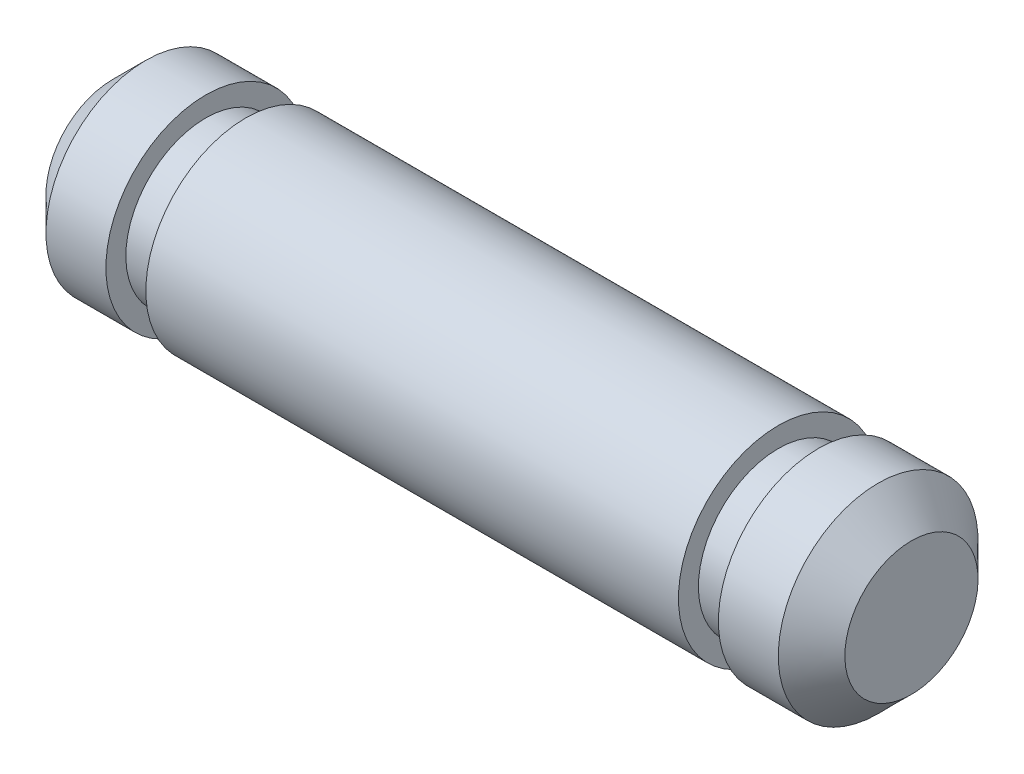
ISO-10303-21;
HEADER;
FILE_DESCRIPTION(('STEP AP214'),'2;1');
FILE_NAME('part.step','',(''),(''),'','','');
FILE_SCHEMA(('AUTOMOTIVE_DESIGN { 1 0 10303 214 1 1 1 1 }'));
ENDSEC;
DATA;
#1=APPLICATION_CONTEXT('core data for automotive mechanical design processes');
#2=APPLICATION_PROTOCOL_DEFINITION('international standard','automotive_design',2000,#1);
#3=PRODUCT_CONTEXT('',#1,'mechanical');
#4=PRODUCT('Part','Part','',(#3));
#5=PRODUCT_RELATED_PRODUCT_CATEGORY('part','',(#4));
#6=PRODUCT_DEFINITION_FORMATION('','',#4);
#7=PRODUCT_DEFINITION_CONTEXT('part definition',#1,'design');
#8=PRODUCT_DEFINITION('design','',#6,#7);
#9=PRODUCT_DEFINITION_SHAPE('','',#8);
#10=(LENGTH_UNIT() NAMED_UNIT(*) SI_UNIT(.MILLI.,.METRE.));
#11=(NAMED_UNIT(*) PLANE_ANGLE_UNIT() SI_UNIT($,.RADIAN.));
#12=(NAMED_UNIT(*) SI_UNIT($,.STERADIAN.) SOLID_ANGLE_UNIT());
#13=UNCERTAINTY_MEASURE_WITH_UNIT(LENGTH_MEASURE(1.E-05),#10,'distance_accuracy_value','');
#14=(GEOMETRIC_REPRESENTATION_CONTEXT(3) GLOBAL_UNCERTAINTY_ASSIGNED_CONTEXT((#13)) GLOBAL_UNIT_ASSIGNED_CONTEXT((#10,
#11,#12)) REPRESENTATION_CONTEXT('',''));
#15=CARTESIAN_POINT('',(0.,0.,0.));
#16=DIRECTION('',(0.,0.,1.));
#17=DIRECTION('',(1.,0.,0.));
#18=AXIS2_PLACEMENT_3D('',#15,#16,#17);
#19=CARTESIAN_POINT('',(-6.,0.,0.));
#20=DIRECTION('',(-1.,0.,0.));
#21=DIRECTION('',(0.,-1.,0.));
#22=AXIS2_PLACEMENT_3D('',#19,#20,#21);
#23=PLANE('',#22);
#24=CARTESIAN_POINT('',(-6.,0.,0.));
#25=DIRECTION('',(1.,0.,0.));
#26=DIRECTION('',(0.,1.,0.));
#27=AXIS2_PLACEMENT_3D('',#24,#25,#26);
#28=CIRCLE('',#27,1.);
#29=CARTESIAN_POINT('',(-6.,0.999999999999999,0.));
#30=VERTEX_POINT('',#29);
#31=EDGE_CURVE('E10',#30,#30,#28,.T.);
#32=ORIENTED_EDGE('',*,*,#31,.F.);
#33=EDGE_LOOP('',(#32));
#34=FACE_BOUND('',#33,.T.);
#35=ADVANCED_FACE('F33',(#34),#23,.T.);
#36=CARTESIAN_POINT('',(-5.5,0.,0.));
#37=DIRECTION('',(1.,0.,0.));
#38=DIRECTION('',(0.,1.,0.));
#39=AXIS2_PLACEMENT_3D('',#36,#37,#38);
#40=CONICAL_SURFACE('',#39,1.5,0.785398163397448);
#41=ORIENTED_EDGE('',*,*,#31,.T.);
#42=EDGE_LOOP('',(#41));
#43=FACE_BOUND('',#42,.T.);
#44=CARTESIAN_POINT('',(-5.5,0.,0.));
#45=DIRECTION('',(1.,0.,0.));
#46=DIRECTION('',(0.,1.,0.));
#47=AXIS2_PLACEMENT_3D('',#44,#45,#46);
#48=CIRCLE('',#47,1.5);
#49=CARTESIAN_POINT('',(-5.5,1.5,0.));
#50=VERTEX_POINT('',#49);
#51=EDGE_CURVE('E39',#50,#50,#48,.T.);
#52=ORIENTED_EDGE('',*,*,#51,.F.);
#53=EDGE_LOOP('',(#52));
#54=FACE_BOUND('',#53,.T.);
#55=ADVANCED_FACE('F93',(#43,#54),#40,.T.);
#56=CARTESIAN_POINT('',(6.,0.,0.));
#57=DIRECTION('',(1.,0.,0.));
#58=DIRECTION('',(0.,1.,0.));
#59=AXIS2_PLACEMENT_3D('',#56,#57,#58);
#60=CYLINDRICAL_SURFACE('',#59,1.5);
#61=ORIENTED_EDGE('',*,*,#51,.T.);
#62=EDGE_LOOP('',(#61));
#63=FACE_BOUND('',#62,.T.);
#64=CARTESIAN_POINT('',(-4.6,0.,0.));
#65=DIRECTION('',(1.,0.,0.));
#66=DIRECTION('',(0.,1.,0.));
#67=AXIS2_PLACEMENT_3D('',#64,#65,#66);
#68=CIRCLE('',#67,1.5);
#69=CARTESIAN_POINT('',(-4.6,1.5,0.));
#70=VERTEX_POINT('',#69);
#71=EDGE_CURVE('E43',#70,#70,#68,.T.);
#72=ORIENTED_EDGE('',*,*,#71,.F.);
#73=EDGE_LOOP('',(#72));
#74=FACE_BOUND('',#73,.T.);
#75=ADVANCED_FACE('F98',(#63,#74),#60,.T.);
#76=CARTESIAN_POINT('',(-4.6,1.5,0.));
#77=DIRECTION('',(1.,0.,0.));
#78=DIRECTION('',(0.,1.,0.));
#79=AXIS2_PLACEMENT_3D('',#76,#77,#78);
#80=PLANE('',#79);
#81=ORIENTED_EDGE('',*,*,#71,.T.);
#82=EDGE_LOOP('',(#81));
#83=FACE_BOUND('',#82,.T.);
#84=CARTESIAN_POINT('',(-4.6,0.,0.));
#85=DIRECTION('',(1.,0.,0.));
#86=DIRECTION('',(0.,1.,0.));
#87=AXIS2_PLACEMENT_3D('',#84,#85,#86);
#88=CIRCLE('',#87,1.2);
#89=CARTESIAN_POINT('',(-4.6,1.2,0.));
#90=VERTEX_POINT('',#89);
#91=EDGE_CURVE('E47',#90,#90,#88,.T.);
#92=ORIENTED_EDGE('',*,*,#91,.F.);
#93=EDGE_LOOP('',(#92));
#94=FACE_BOUND('',#93,.T.);
#95=ADVANCED_FACE('F102',(#83,#94),#80,.T.);
#96=CARTESIAN_POINT('',(6.,0.,0.));
#97=DIRECTION('',(1.,0.,0.));
#98=DIRECTION('',(0.,1.,0.));
#99=AXIS2_PLACEMENT_3D('',#96,#97,#98);
#100=CYLINDRICAL_SURFACE('',#99,1.2);
#101=ORIENTED_EDGE('',*,*,#91,.T.);
#102=EDGE_LOOP('',(#101));
#103=FACE_BOUND('',#102,.T.);
#104=CARTESIAN_POINT('',(-4.,0.,0.));
#105=DIRECTION('',(1.,0.,0.));
#106=DIRECTION('',(0.,1.,0.));
#107=AXIS2_PLACEMENT_3D('',#104,#105,#106);
#108=CIRCLE('',#107,1.2);
#109=CARTESIAN_POINT('',(-4.,1.2,0.));
#110=VERTEX_POINT('',#109);
#111=EDGE_CURVE('E52',#110,#110,#108,.T.);
#112=ORIENTED_EDGE('',*,*,#111,.F.);
#113=EDGE_LOOP('',(#112));
#114=FACE_BOUND('',#113,.T.);
#115=ADVANCED_FACE('F108',(#103,#114),#100,.T.);
#116=CARTESIAN_POINT('',(-4.,1.2,0.));
#117=DIRECTION('',(-1.,0.,0.));
#118=DIRECTION('',(0.,-1.,0.));
#119=AXIS2_PLACEMENT_3D('',#116,#117,#118);
#120=PLANE('',#119);
#121=ORIENTED_EDGE('',*,*,#111,.T.);
#122=EDGE_LOOP('',(#121));
#123=FACE_BOUND('',#122,.T.);
#124=CARTESIAN_POINT('',(-4.,0.,0.));
#125=DIRECTION('',(1.,0.,0.));
#126=DIRECTION('',(0.,1.,0.));
#127=AXIS2_PLACEMENT_3D('',#124,#125,#126);
#128=CIRCLE('',#127,1.5);
#129=CARTESIAN_POINT('',(-4.,1.5,0.));
#130=VERTEX_POINT('',#129);
#131=EDGE_CURVE('E55',#130,#130,#128,.T.);
#132=ORIENTED_EDGE('',*,*,#131,.F.);
#133=EDGE_LOOP('',(#132));
#134=FACE_BOUND('',#133,.T.);
#135=ADVANCED_FACE('F112',(#123,#134),#120,.T.);
#136=CARTESIAN_POINT('',(6.,0.,0.));
#137=DIRECTION('',(1.,0.,0.));
#138=DIRECTION('',(0.,1.,0.));
#139=AXIS2_PLACEMENT_3D('',#136,#137,#138);
#140=CYLINDRICAL_SURFACE('',#139,1.5);
#141=ORIENTED_EDGE('',*,*,#131,.T.);
#142=EDGE_LOOP('',(#141));
#143=FACE_BOUND('',#142,.T.);
#144=CARTESIAN_POINT('',(4.,0.,0.));
#145=DIRECTION('',(1.,0.,0.));
#146=DIRECTION('',(0.,1.,0.));
#147=AXIS2_PLACEMENT_3D('',#144,#145,#146);
#148=CIRCLE('',#147,1.5);
#149=CARTESIAN_POINT('',(4.,1.5,0.));
#150=VERTEX_POINT('',#149);
#151=EDGE_CURVE('E58',#150,#150,#148,.T.);
#152=ORIENTED_EDGE('',*,*,#151,.F.);
#153=EDGE_LOOP('',(#152));
#154=FACE_BOUND('',#153,.T.);
#155=ADVANCED_FACE('F116',(#143,#154),#140,.T.);
#156=CARTESIAN_POINT('',(4.,1.2,0.));
#157=DIRECTION('',(1.,0.,0.));
#158=DIRECTION('',(0.,1.,0.));
#159=AXIS2_PLACEMENT_3D('',#156,#157,#158);
#160=PLANE('',#159);
#161=ORIENTED_EDGE('',*,*,#151,.T.);
#162=EDGE_LOOP('',(#161));
#163=FACE_BOUND('',#162,.T.);
#164=CARTESIAN_POINT('',(4.,0.,0.));
#165=DIRECTION('',(1.,0.,0.));
#166=DIRECTION('',(0.,1.,0.));
#167=AXIS2_PLACEMENT_3D('',#164,#165,#166);
#168=CIRCLE('',#167,1.2);
#169=CARTESIAN_POINT('',(4.,1.2,0.));
#170=VERTEX_POINT('',#169);
#171=EDGE_CURVE('E61',#170,#170,#168,.T.);
#172=ORIENTED_EDGE('',*,*,#171,.F.);
#173=EDGE_LOOP('',(#172));
#174=FACE_BOUND('',#173,.T.);
#175=ADVANCED_FACE('F120',(#163,#174),#160,.T.);
#176=CARTESIAN_POINT('',(6.,0.,0.));
#177=DIRECTION('',(1.,0.,0.));
#178=DIRECTION('',(0.,1.,0.));
#179=AXIS2_PLACEMENT_3D('',#176,#177,#178);
#180=CYLINDRICAL_SURFACE('',#179,1.2);
#181=ORIENTED_EDGE('',*,*,#171,.T.);
#182=EDGE_LOOP('',(#181));
#183=FACE_BOUND('',#182,.T.);
#184=CARTESIAN_POINT('',(4.6,0.,0.));
#185=DIRECTION('',(1.,0.,0.));
#186=DIRECTION('',(0.,1.,0.));
#187=AXIS2_PLACEMENT_3D('',#184,#185,#186);
#188=CIRCLE('',#187,1.2);
#189=CARTESIAN_POINT('',(4.6,1.2,0.));
#190=VERTEX_POINT('',#189);
#191=EDGE_CURVE('E64',#190,#190,#188,.T.);
#192=ORIENTED_EDGE('',*,*,#191,.F.);
#193=EDGE_LOOP('',(#192));
#194=FACE_BOUND('',#193,.T.);
#195=ADVANCED_FACE('F124',(#183,#194),#180,.T.);
#196=CARTESIAN_POINT('',(4.6,1.5,0.));
#197=DIRECTION('',(-1.,0.,0.));
#198=DIRECTION('',(0.,-1.,0.));
#199=AXIS2_PLACEMENT_3D('',#196,#197,#198);
#200=PLANE('',#199);
#201=ORIENTED_EDGE('',*,*,#191,.T.);
#202=EDGE_LOOP('',(#201));
#203=FACE_BOUND('',#202,.T.);
#204=CARTESIAN_POINT('',(4.6,0.,0.));
#205=DIRECTION('',(1.,0.,0.));
#206=DIRECTION('',(0.,1.,0.));
#207=AXIS2_PLACEMENT_3D('',#204,#205,#206);
#208=CIRCLE('',#207,1.5);
#209=CARTESIAN_POINT('',(4.6,1.5,0.));
#210=VERTEX_POINT('',#209);
#211=EDGE_CURVE('E67',#210,#210,#208,.T.);
#212=ORIENTED_EDGE('',*,*,#211,.F.);
#213=EDGE_LOOP('',(#212));
#214=FACE_BOUND('',#213,.T.);
#215=ADVANCED_FACE('F89',(#203,#214),#200,.T.);
#216=CARTESIAN_POINT('',(6.,0.,0.));
#217=DIRECTION('',(1.,0.,0.));
#218=DIRECTION('',(0.,1.,0.));
#219=AXIS2_PLACEMENT_3D('',#216,#217,#218);
#220=CYLINDRICAL_SURFACE('',#219,1.5);
#221=ORIENTED_EDGE('',*,*,#211,.T.);
#222=EDGE_LOOP('',(#221));
#223=FACE_BOUND('',#222,.T.);
#224=CARTESIAN_POINT('',(5.5,0.,0.));
#225=DIRECTION('',(1.,0.,0.));
#226=DIRECTION('',(0.,1.,0.));
#227=AXIS2_PLACEMENT_3D('',#224,#225,#226);
#228=CIRCLE('',#227,1.5);
#229=CARTESIAN_POINT('',(5.5,1.5,0.));
#230=VERTEX_POINT('',#229);
#231=EDGE_CURVE('E70',#230,#230,#228,.T.);
#232=ORIENTED_EDGE('',*,*,#231,.F.);
#233=EDGE_LOOP('',(#232));
#234=FACE_BOUND('',#233,.T.);
#235=ADVANCED_FACE('F81',(#223,#234),#220,.T.);
#236=CARTESIAN_POINT('',(6.,0.,0.));
#237=DIRECTION('',(-1.,0.,0.));
#238=DIRECTION('',(0.,-1.,0.));
#239=AXIS2_PLACEMENT_3D('',#236,#237,#238);
#240=CONICAL_SURFACE('',#239,1.,0.785398163397448);
#241=ORIENTED_EDGE('',*,*,#231,.T.);
#242=EDGE_LOOP('',(#241));
#243=FACE_BOUND('',#242,.T.);
#244=CARTESIAN_POINT('',(6.,0.,0.));
#245=DIRECTION('',(1.,0.,0.));
#246=DIRECTION('',(0.,1.,0.));
#247=AXIS2_PLACEMENT_3D('',#244,#245,#246);
#248=CIRCLE('',#247,1.);
#249=CARTESIAN_POINT('',(6.,1.,0.));
#250=VERTEX_POINT('',#249);
#251=EDGE_CURVE('E73',#250,#250,#248,.T.);
#252=ORIENTED_EDGE('',*,*,#251,.F.);
#253=EDGE_LOOP('',(#252));
#254=FACE_BOUND('',#253,.T.);
#255=ADVANCED_FACE('F79',(#243,#254),#240,.T.);
#256=CARTESIAN_POINT('',(6.,0.,0.));
#257=DIRECTION('',(1.,0.,0.));
#258=DIRECTION('',(0.,1.,0.));
#259=AXIS2_PLACEMENT_3D('',#256,#257,#258);
#260=PLANE('',#259);
#261=ORIENTED_EDGE('',*,*,#251,.T.);
#262=EDGE_LOOP('',(#261));
#263=FACE_BOUND('',#262,.T.);
#264=ADVANCED_FACE('F77',(#263),#260,.T.);
#265=CLOSED_SHELL('',(#35,#55,#75,#95,#115,#135,#155,#175,#195,#215,#235,#255,#264));
#266=MANIFOLD_SOLID_BREP('B2',#265);
#267=ADVANCED_BREP_SHAPE_REPRESENTATION('',(#18,#266),#14);
#268=SHAPE_DEFINITION_REPRESENTATION(#9,#267);
ENDSEC;
END-ISO-10303-21;
